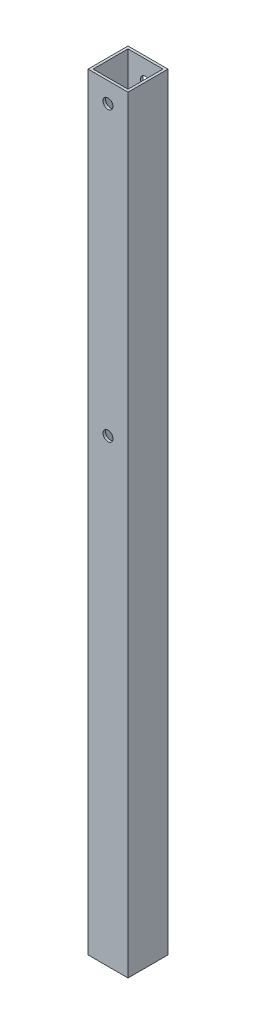
ISO-10303-21;
HEADER;
FILE_DESCRIPTION(('STEP AP214'),'2;1');
FILE_NAME('part.step','',(''),(''),'','','');
FILE_SCHEMA(('AUTOMOTIVE_DESIGN { 1 0 10303 214 1 1 1 1 }'));
ENDSEC;
DATA;
#1=APPLICATION_CONTEXT('core data for automotive mechanical design processes');
#2=APPLICATION_PROTOCOL_DEFINITION('international standard','automotive_design',2000,#1);
#3=PRODUCT_CONTEXT('',#1,'mechanical');
#4=PRODUCT('Part','Part','',(#3));
#5=PRODUCT_RELATED_PRODUCT_CATEGORY('part','',(#4));
#6=PRODUCT_DEFINITION_FORMATION('','',#4);
#7=PRODUCT_DEFINITION_CONTEXT('part definition',#1,'design');
#8=PRODUCT_DEFINITION('design','',#6,#7);
#9=PRODUCT_DEFINITION_SHAPE('','',#8);
#10=(LENGTH_UNIT() NAMED_UNIT(*) SI_UNIT(.MILLI.,.METRE.));
#11=(NAMED_UNIT(*) PLANE_ANGLE_UNIT() SI_UNIT($,.RADIAN.));
#12=(NAMED_UNIT(*) SI_UNIT($,.STERADIAN.) SOLID_ANGLE_UNIT());
#13=UNCERTAINTY_MEASURE_WITH_UNIT(LENGTH_MEASURE(1.E-05),#10,'distance_accuracy_value','');
#14=(GEOMETRIC_REPRESENTATION_CONTEXT(3) GLOBAL_UNCERTAINTY_ASSIGNED_CONTEXT((#13)) GLOBAL_UNIT_ASSIGNED_CONTEXT((#10,
#11,#12)) REPRESENTATION_CONTEXT('',''));
#15=CARTESIAN_POINT('',(0.,0.,0.));
#16=DIRECTION('',(0.,0.,1.));
#17=DIRECTION('',(1.,0.,0.));
#18=AXIS2_PLACEMENT_3D('',#15,#16,#17);
#19=CARTESIAN_POINT('',(0.,487.68,0.));
#20=DIRECTION('',(0.,-1.,0.));
#21=DIRECTION('',(0.,0.,-1.));
#22=AXIS2_PLACEMENT_3D('',#19,#20,#21);
#23=PLANE('',#22);
#24=DIRECTION('',(0.,0.,-1.));
#25=VECTOR('',#24,1.);
#26=CARTESIAN_POINT('',(12.7,487.68,12.7));
#27=LINE('',#26,#25);
#28=CARTESIAN_POINT('',(12.7,487.68,12.7));
#29=VERTEX_POINT('',#28);
#30=CARTESIAN_POINT('',(12.7,487.68,-12.7));
#31=VERTEX_POINT('',#30);
#32=EDGE_CURVE('E155',#29,#31,#27,.T.);
#33=ORIENTED_EDGE('',*,*,#32,.T.);
#34=DIRECTION('',(-1.,0.,0.));
#35=VECTOR('',#34,1.);
#36=CARTESIAN_POINT('',(-12.7,487.68,-12.7));
#37=LINE('',#36,#35);
#38=CARTESIAN_POINT('',(-12.7,487.68,-12.7));
#39=VERTEX_POINT('',#38);
#40=EDGE_CURVE('E159',#31,#39,#37,.T.);
#41=ORIENTED_EDGE('',*,*,#40,.T.);
#42=DIRECTION('',(0.,0.,1.));
#43=VECTOR('',#42,1.);
#44=CARTESIAN_POINT('',(-12.7,487.68,12.7));
#45=LINE('',#44,#43);
#46=CARTESIAN_POINT('',(-12.7,487.68,12.7));
#47=VERTEX_POINT('',#46);
#48=EDGE_CURVE('E163',#39,#47,#45,.T.);
#49=ORIENTED_EDGE('',*,*,#48,.T.);
#50=DIRECTION('',(1.,0.,0.));
#51=VECTOR('',#50,1.);
#52=CARTESIAN_POINT('',(-12.7,487.68,12.7));
#53=LINE('',#52,#51);
#54=EDGE_CURVE('E166',#47,#29,#53,.T.);
#55=ORIENTED_EDGE('',*,*,#54,.T.);
#56=EDGE_LOOP('',(#33,#41,#49,#55));
#57=FACE_BOUND('',#56,.T.);
#58=DIRECTION('',(0.,0.,-1.));
#59=VECTOR('',#58,1.);
#60=CARTESIAN_POINT('',(11.1125,487.68,11.1125));
#61=LINE('',#60,#59);
#62=CARTESIAN_POINT('',(11.1125,487.68,11.1125));
#63=VERTEX_POINT('',#62);
#64=CARTESIAN_POINT('',(11.1125,487.68,-11.1125));
#65=VERTEX_POINT('',#64);
#66=EDGE_CURVE('E105',#63,#65,#61,.T.);
#67=ORIENTED_EDGE('',*,*,#66,.F.);
#68=DIRECTION('',(1.,0.,0.));
#69=VECTOR('',#68,1.);
#70=CARTESIAN_POINT('',(-11.1125,487.68,11.1125));
#71=LINE('',#70,#69);
#72=CARTESIAN_POINT('',(-11.1125,487.68,11.1125));
#73=VERTEX_POINT('',#72);
#74=EDGE_CURVE('E131',#73,#63,#71,.T.);
#75=ORIENTED_EDGE('',*,*,#74,.F.);
#76=DIRECTION('',(0.,0.,1.));
#77=VECTOR('',#76,1.);
#78=CARTESIAN_POINT('',(-11.1125,487.68,11.1125));
#79=LINE('',#78,#77);
#80=CARTESIAN_POINT('',(-11.1125,487.68,-11.1125));
#81=VERTEX_POINT('',#80);
#82=EDGE_CURVE('E127',#81,#73,#79,.T.);
#83=ORIENTED_EDGE('',*,*,#82,.F.);
#84=DIRECTION('',(-1.,0.,0.));
#85=VECTOR('',#84,1.);
#86=CARTESIAN_POINT('',(-11.1125,487.68,-11.1125));
#87=LINE('',#86,#85);
#88=EDGE_CURVE('E114',#65,#81,#87,.T.);
#89=ORIENTED_EDGE('',*,*,#88,.F.);
#90=EDGE_LOOP('',(#67,#75,#83,#89));
#91=FACE_BOUND('',#90,.T.);
#92=ADVANCED_FACE('F38',(#57,#91),#23,.F.);
#93=CARTESIAN_POINT('',(0.,0.,0.));
#94=DIRECTION('',(0.,-1.,0.));
#95=DIRECTION('',(0.,0.,-1.));
#96=AXIS2_PLACEMENT_3D('',#93,#94,#95);
#97=PLANE('',#96);
#98=DIRECTION('',(0.,0.,-1.));
#99=VECTOR('',#98,1.);
#100=CARTESIAN_POINT('',(12.7,0.,12.7));
#101=LINE('',#100,#99);
#102=CARTESIAN_POINT('',(12.7,0.,12.7));
#103=VERTEX_POINT('',#102);
#104=CARTESIAN_POINT('',(12.7,0.,-12.7));
#105=VERTEX_POINT('',#104);
#106=EDGE_CURVE('E123',#103,#105,#101,.T.);
#107=ORIENTED_EDGE('',*,*,#106,.F.);
#108=DIRECTION('',(1.,0.,0.));
#109=VECTOR('',#108,1.);
#110=CARTESIAN_POINT('',(-12.7,0.,12.7));
#111=LINE('',#110,#109);
#112=CARTESIAN_POINT('',(-12.7,0.,12.7));
#113=VERTEX_POINT('',#112);
#114=EDGE_CURVE('E160',#113,#103,#111,.T.);
#115=ORIENTED_EDGE('',*,*,#114,.F.);
#116=DIRECTION('',(0.,0.,1.));
#117=VECTOR('',#116,1.);
#118=CARTESIAN_POINT('',(-12.7,0.,12.7));
#119=LINE('',#118,#117);
#120=CARTESIAN_POINT('',(-12.7,0.,-12.7));
#121=VERTEX_POINT('',#120);
#122=EDGE_CURVE('E176',#121,#113,#119,.T.);
#123=ORIENTED_EDGE('',*,*,#122,.F.);
#124=DIRECTION('',(-1.,0.,0.));
#125=VECTOR('',#124,1.);
#126=CARTESIAN_POINT('',(-12.7,0.,-12.7));
#127=LINE('',#126,#125);
#128=EDGE_CURVE('E173',#105,#121,#127,.T.);
#129=ORIENTED_EDGE('',*,*,#128,.F.);
#130=EDGE_LOOP('',(#107,#115,#123,#129));
#131=FACE_BOUND('',#130,.T.);
#132=DIRECTION('',(1.,0.,0.));
#133=VECTOR('',#132,1.);
#134=CARTESIAN_POINT('',(-11.1125,0.,11.1125));
#135=LINE('',#134,#133);
#136=CARTESIAN_POINT('',(-11.1125,0.,11.1125));
#137=VERTEX_POINT('',#136);
#138=CARTESIAN_POINT('',(11.1125,0.,11.1125));
#139=VERTEX_POINT('',#138);
#140=EDGE_CURVE('E115',#137,#139,#135,.T.);
#141=ORIENTED_EDGE('',*,*,#140,.T.);
#142=DIRECTION('',(0.,0.,-1.));
#143=VECTOR('',#142,1.);
#144=CARTESIAN_POINT('',(11.1125,0.,11.1125));
#145=LINE('',#144,#143);
#146=CARTESIAN_POINT('',(11.1125,0.,-11.1125));
#147=VERTEX_POINT('',#146);
#148=EDGE_CURVE('E63',#139,#147,#145,.T.);
#149=ORIENTED_EDGE('',*,*,#148,.T.);
#150=DIRECTION('',(-1.,0.,0.));
#151=VECTOR('',#150,1.);
#152=CARTESIAN_POINT('',(-11.1125,0.,-11.1125));
#153=LINE('',#152,#151);
#154=CARTESIAN_POINT('',(-11.1125,0.,-11.1125));
#155=VERTEX_POINT('',#154);
#156=EDGE_CURVE('E121',#147,#155,#153,.T.);
#157=ORIENTED_EDGE('',*,*,#156,.T.);
#158=DIRECTION('',(0.,0.,1.));
#159=VECTOR('',#158,1.);
#160=CARTESIAN_POINT('',(-11.1125,0.,11.1125));
#161=LINE('',#160,#159);
#162=EDGE_CURVE('E142',#155,#137,#161,.T.);
#163=ORIENTED_EDGE('',*,*,#162,.T.);
#164=EDGE_LOOP('',(#141,#149,#157,#163));
#165=FACE_BOUND('',#164,.T.);
#166=ADVANCED_FACE('F200',(#131,#165),#97,.T.);
#167=CARTESIAN_POINT('',(12.7,487.68,12.7));
#168=DIRECTION('',(-1.,0.,0.));
#169=DIRECTION('',(0.,0.,1.));
#170=AXIS2_PLACEMENT_3D('',#167,#168,#169);
#171=PLANE('',#170);
#172=ORIENTED_EDGE('',*,*,#106,.T.);
#173=DIRECTION('',(0.,-1.,0.));
#174=VECTOR('',#173,1.);
#175=CARTESIAN_POINT('',(12.7,487.68,-12.7));
#176=LINE('',#175,#174);
#177=EDGE_CURVE('E11',#31,#105,#176,.T.);
#178=ORIENTED_EDGE('',*,*,#177,.F.);
#179=ORIENTED_EDGE('',*,*,#32,.F.);
#180=DIRECTION('',(0.,-1.,0.));
#181=VECTOR('',#180,1.);
#182=CARTESIAN_POINT('',(12.7,487.68,12.7));
#183=LINE('',#182,#181);
#184=EDGE_CURVE('E169',#29,#103,#183,.T.);
#185=ORIENTED_EDGE('',*,*,#184,.T.);
#186=EDGE_LOOP('',(#172,#178,#179,#185));
#187=FACE_BOUND('',#186,.T.);
#188=ADVANCED_FACE('F40',(#187),#171,.F.);
#189=CARTESIAN_POINT('',(-12.7,487.68,-12.7));
#190=DIRECTION('',(0.,0.,1.));
#191=DIRECTION('',(1.,0.,0.));
#192=AXIS2_PLACEMENT_3D('',#189,#190,#191);
#193=PLANE('',#192);
#194=CARTESIAN_POINT('',(0.,292.1,-12.7));
#195=DIRECTION('',(0.,0.,1.));
#196=DIRECTION('',(1.,0.,0.));
#197=AXIS2_PLACEMENT_3D('',#194,#195,#196);
#198=CIRCLE('',#197,3.17499999999999);
#199=CARTESIAN_POINT('',(3.17500000000001,292.1,-12.7));
#200=VERTEX_POINT('',#199);
#201=EDGE_CURVE('E296',#200,#200,#198,.T.);
#202=ORIENTED_EDGE('',*,*,#201,.T.);
#203=EDGE_LOOP('',(#202));
#204=FACE_BOUND('',#203,.T.);
#205=CARTESIAN_POINT('',(0.,474.98,-12.7));
#206=DIRECTION('',(0.,0.,1.));
#207=DIRECTION('',(1.,0.,0.));
#208=AXIS2_PLACEMENT_3D('',#205,#206,#207);
#209=CIRCLE('',#208,3.17499999999999);
#210=CARTESIAN_POINT('',(3.17499999999999,474.98,-12.7));
#211=VERTEX_POINT('',#210);
#212=EDGE_CURVE('E245',#211,#211,#209,.T.);
#213=ORIENTED_EDGE('',*,*,#212,.T.);
#214=EDGE_LOOP('',(#213));
#215=FACE_BOUND('',#214,.T.);
#216=ORIENTED_EDGE('',*,*,#128,.T.);
#217=DIRECTION('',(0.,-1.,0.));
#218=VECTOR('',#217,1.);
#219=CARTESIAN_POINT('',(-12.7,487.68,-12.7));
#220=LINE('',#219,#218);
#221=EDGE_CURVE('E48',#39,#121,#220,.T.);
#222=ORIENTED_EDGE('',*,*,#221,.F.);
#223=ORIENTED_EDGE('',*,*,#40,.F.);
#224=ORIENTED_EDGE('',*,*,#177,.T.);
#225=EDGE_LOOP('',(#216,#222,#223,#224));
#226=FACE_BOUND('',#225,.T.);
#227=ADVANCED_FACE('F210',(#204,#215,#226),#193,.F.);
#228=CARTESIAN_POINT('',(-12.7,487.68,12.7));
#229=DIRECTION('',(1.,0.,0.));
#230=DIRECTION('',(0.,0.,-1.));
#231=AXIS2_PLACEMENT_3D('',#228,#229,#230);
#232=PLANE('',#231);
#233=ORIENTED_EDGE('',*,*,#122,.T.);
#234=DIRECTION('',(0.,-1.,0.));
#235=VECTOR('',#234,1.);
#236=CARTESIAN_POINT('',(-12.7,487.68,12.7));
#237=LINE('',#236,#235);
#238=EDGE_CURVE('E184',#47,#113,#237,.T.);
#239=ORIENTED_EDGE('',*,*,#238,.F.);
#240=ORIENTED_EDGE('',*,*,#48,.F.);
#241=ORIENTED_EDGE('',*,*,#221,.T.);
#242=EDGE_LOOP('',(#233,#239,#240,#241));
#243=FACE_BOUND('',#242,.T.);
#244=ADVANCED_FACE('F194',(#243),#232,.F.);
#245=CARTESIAN_POINT('',(-12.7,487.68,12.7));
#246=DIRECTION('',(0.,0.,-1.));
#247=DIRECTION('',(-1.,0.,0.));
#248=AXIS2_PLACEMENT_3D('',#245,#246,#247);
#249=PLANE('',#248);
#250=CARTESIAN_POINT('',(0.,292.1,12.7));
#251=DIRECTION('',(0.,0.,1.));
#252=DIRECTION('',(1.,0.,0.));
#253=AXIS2_PLACEMENT_3D('',#250,#251,#252);
#254=CIRCLE('',#253,3.17499999999999);
#255=CARTESIAN_POINT('',(3.17500000000001,292.1,12.7));
#256=VERTEX_POINT('',#255);
#257=EDGE_CURVE('E239',#256,#256,#254,.T.);
#258=ORIENTED_EDGE('',*,*,#257,.F.);
#259=EDGE_LOOP('',(#258));
#260=FACE_BOUND('',#259,.T.);
#261=CARTESIAN_POINT('',(0.,474.98,12.7));
#262=DIRECTION('',(0.,0.,1.));
#263=DIRECTION('',(1.,0.,0.));
#264=AXIS2_PLACEMENT_3D('',#261,#262,#263);
#265=CIRCLE('',#264,3.17499999999999);
#266=CARTESIAN_POINT('',(3.17499999999999,474.98,12.7));
#267=VERTEX_POINT('',#266);
#268=EDGE_CURVE('E242',#267,#267,#265,.T.);
#269=ORIENTED_EDGE('',*,*,#268,.F.);
#270=EDGE_LOOP('',(#269));
#271=FACE_BOUND('',#270,.T.);
#272=ORIENTED_EDGE('',*,*,#114,.T.);
#273=ORIENTED_EDGE('',*,*,#184,.F.);
#274=ORIENTED_EDGE('',*,*,#54,.F.);
#275=ORIENTED_EDGE('',*,*,#238,.T.);
#276=EDGE_LOOP('',(#272,#273,#274,#275));
#277=FACE_BOUND('',#276,.T.);
#278=ADVANCED_FACE('F204',(#260,#271,#277),#249,.F.);
#279=CARTESIAN_POINT('',(11.1125,487.68,11.1125));
#280=DIRECTION('',(-1.,0.,0.));
#281=DIRECTION('',(0.,0.,1.));
#282=AXIS2_PLACEMENT_3D('',#279,#280,#281);
#283=PLANE('',#282);
#284=ORIENTED_EDGE('',*,*,#148,.F.);
#285=DIRECTION('',(0.,-1.,0.));
#286=VECTOR('',#285,1.);
#287=CARTESIAN_POINT('',(11.1125,487.68,11.1125));
#288=LINE('',#287,#286);
#289=EDGE_CURVE('E109',#63,#139,#288,.T.);
#290=ORIENTED_EDGE('',*,*,#289,.F.);
#291=ORIENTED_EDGE('',*,*,#66,.T.);
#292=DIRECTION('',(0.,-1.,0.));
#293=VECTOR('',#292,1.);
#294=CARTESIAN_POINT('',(11.1125,487.68,-11.1125));
#295=LINE('',#294,#293);
#296=EDGE_CURVE('E108',#65,#147,#295,.T.);
#297=ORIENTED_EDGE('',*,*,#296,.T.);
#298=EDGE_LOOP('',(#284,#290,#291,#297));
#299=FACE_BOUND('',#298,.T.);
#300=ADVANCED_FACE('F107',(#299),#283,.T.);
#301=CARTESIAN_POINT('',(-11.1125,487.68,-11.1125));
#302=DIRECTION('',(0.,0.,1.));
#303=DIRECTION('',(1.,0.,0.));
#304=AXIS2_PLACEMENT_3D('',#301,#302,#303);
#305=PLANE('',#304);
#306=CARTESIAN_POINT('',(0.,292.1,-11.1125));
#307=DIRECTION('',(0.,0.,1.));
#308=DIRECTION('',(1.,0.,0.));
#309=AXIS2_PLACEMENT_3D('',#306,#307,#308);
#310=CIRCLE('',#309,3.17499999999999);
#311=CARTESIAN_POINT('',(3.17500000000001,292.1,-11.1125));
#312=VERTEX_POINT('',#311);
#313=EDGE_CURVE('E246',#312,#312,#310,.T.);
#314=ORIENTED_EDGE('',*,*,#313,.F.);
#315=EDGE_LOOP('',(#314));
#316=FACE_BOUND('',#315,.T.);
#317=CARTESIAN_POINT('',(0.,474.98,-11.1125));
#318=DIRECTION('',(0.,0.,1.));
#319=DIRECTION('',(1.,0.,0.));
#320=AXIS2_PLACEMENT_3D('',#317,#318,#319);
#321=CIRCLE('',#320,3.17499999999999);
#322=CARTESIAN_POINT('',(3.17499999999999,474.98,-11.1125));
#323=VERTEX_POINT('',#322);
#324=EDGE_CURVE('E139',#323,#323,#321,.T.);
#325=ORIENTED_EDGE('',*,*,#324,.F.);
#326=EDGE_LOOP('',(#325));
#327=FACE_BOUND('',#326,.T.);
#328=ORIENTED_EDGE('',*,*,#156,.F.);
#329=ORIENTED_EDGE('',*,*,#296,.F.);
#330=ORIENTED_EDGE('',*,*,#88,.T.);
#331=DIRECTION('',(0.,-1.,0.));
#332=VECTOR('',#331,1.);
#333=CARTESIAN_POINT('',(-11.1125,487.68,-11.1125));
#334=LINE('',#333,#332);
#335=EDGE_CURVE('E124',#81,#155,#334,.T.);
#336=ORIENTED_EDGE('',*,*,#335,.T.);
#337=EDGE_LOOP('',(#328,#329,#330,#336));
#338=FACE_BOUND('',#337,.T.);
#339=ADVANCED_FACE('F118',(#316,#327,#338),#305,.T.);
#340=CARTESIAN_POINT('',(-11.1125,487.68,11.1125));
#341=DIRECTION('',(1.,0.,0.));
#342=DIRECTION('',(0.,0.,-1.));
#343=AXIS2_PLACEMENT_3D('',#340,#341,#342);
#344=PLANE('',#343);
#345=ORIENTED_EDGE('',*,*,#162,.F.);
#346=ORIENTED_EDGE('',*,*,#335,.F.);
#347=ORIENTED_EDGE('',*,*,#82,.T.);
#348=DIRECTION('',(0.,-1.,0.));
#349=VECTOR('',#348,1.);
#350=CARTESIAN_POINT('',(-11.1125,487.68,11.1125));
#351=LINE('',#350,#349);
#352=EDGE_CURVE('E55',#73,#137,#351,.T.);
#353=ORIENTED_EDGE('',*,*,#352,.T.);
#354=EDGE_LOOP('',(#345,#346,#347,#353));
#355=FACE_BOUND('',#354,.T.);
#356=ADVANCED_FACE('F266',(#355),#344,.T.);
#357=CARTESIAN_POINT('',(-11.1125,487.68,11.1125));
#358=DIRECTION('',(0.,0.,-1.));
#359=DIRECTION('',(-1.,0.,0.));
#360=AXIS2_PLACEMENT_3D('',#357,#358,#359);
#361=PLANE('',#360);
#362=CARTESIAN_POINT('',(0.,292.1,11.1125));
#363=DIRECTION('',(0.,0.,-1.));
#364=DIRECTION('',(-1.,0.,0.));
#365=AXIS2_PLACEMENT_3D('',#362,#363,#364);
#366=CIRCLE('',#365,3.17499999999999);
#367=CARTESIAN_POINT('',(-3.17499999999996,292.1,11.1125));
#368=VERTEX_POINT('',#367);
#369=EDGE_CURVE('E42',#368,#368,#366,.T.);
#370=ORIENTED_EDGE('',*,*,#369,.F.);
#371=EDGE_LOOP('',(#370));
#372=FACE_BOUND('',#371,.T.);
#373=CARTESIAN_POINT('',(0.,474.98,11.1125));
#374=DIRECTION('',(0.,0.,-1.));
#375=DIRECTION('',(-1.,0.,0.));
#376=AXIS2_PLACEMENT_3D('',#373,#374,#375);
#377=CIRCLE('',#376,3.17499999999999);
#378=CARTESIAN_POINT('',(-3.17499999999998,474.98,11.1125));
#379=VERTEX_POINT('',#378);
#380=EDGE_CURVE('E251',#379,#379,#377,.T.);
#381=ORIENTED_EDGE('',*,*,#380,.F.);
#382=EDGE_LOOP('',(#381));
#383=FACE_BOUND('',#382,.T.);
#384=ORIENTED_EDGE('',*,*,#140,.F.);
#385=ORIENTED_EDGE('',*,*,#352,.F.);
#386=ORIENTED_EDGE('',*,*,#74,.T.);
#387=ORIENTED_EDGE('',*,*,#289,.T.);
#388=EDGE_LOOP('',(#384,#385,#386,#387));
#389=FACE_BOUND('',#388,.T.);
#390=ADVANCED_FACE('F272',(#372,#383,#389),#361,.T.);
#391=CARTESIAN_POINT('',(0.,474.98,12.7));
#392=DIRECTION('',(0.,0.,1.));
#393=DIRECTION('',(1.,0.,0.));
#394=AXIS2_PLACEMENT_3D('',#391,#392,#393);
#395=CYLINDRICAL_SURFACE('',#394,3.17499999999999);
#396=ORIENTED_EDGE('',*,*,#380,.T.);
#397=EDGE_LOOP('',(#396));
#398=FACE_BOUND('',#397,.T.);
#399=ORIENTED_EDGE('',*,*,#268,.T.);
#400=EDGE_LOOP('',(#399));
#401=FACE_BOUND('',#400,.T.);
#402=ADVANCED_FACE('F278',(#398,#401),#395,.F.);
#403=ORIENTED_EDGE('',*,*,#324,.T.);
#404=EDGE_LOOP('',(#403));
#405=FACE_BOUND('',#404,.T.);
#406=ORIENTED_EDGE('',*,*,#212,.F.);
#407=EDGE_LOOP('',(#406));
#408=FACE_BOUND('',#407,.T.);
#409=ADVANCED_FACE('F263',(#405,#408),#395,.F.);
#410=CARTESIAN_POINT('',(0.,292.1,12.7));
#411=DIRECTION('',(0.,0.,1.));
#412=DIRECTION('',(1.,0.,0.));
#413=AXIS2_PLACEMENT_3D('',#410,#411,#412);
#414=CYLINDRICAL_SURFACE('',#413,3.17499999999999);
#415=ORIENTED_EDGE('',*,*,#369,.T.);
#416=EDGE_LOOP('',(#415));
#417=FACE_BOUND('',#416,.T.);
#418=ORIENTED_EDGE('',*,*,#257,.T.);
#419=EDGE_LOOP('',(#418));
#420=FACE_BOUND('',#419,.T.);
#421=ADVANCED_FACE('F283',(#417,#420),#414,.F.);
#422=ORIENTED_EDGE('',*,*,#313,.T.);
#423=EDGE_LOOP('',(#422));
#424=FACE_BOUND('',#423,.T.);
#425=ORIENTED_EDGE('',*,*,#201,.F.);
#426=EDGE_LOOP('',(#425));
#427=FACE_BOUND('',#426,.T.);
#428=ADVANCED_FACE('F285',(#424,#427),#414,.F.);
#429=CLOSED_SHELL('',(#92,#166,#188,#227,#244,#278,#300,#339,#356,#390,#402,#409,#421,#428));
#430=MANIFOLD_SOLID_BREP('B2',#429);
#431=ADVANCED_BREP_SHAPE_REPRESENTATION('',(#18,#430),#14);
#432=SHAPE_DEFINITION_REPRESENTATION(#9,#431);
ENDSEC;
END-ISO-10303-21;
